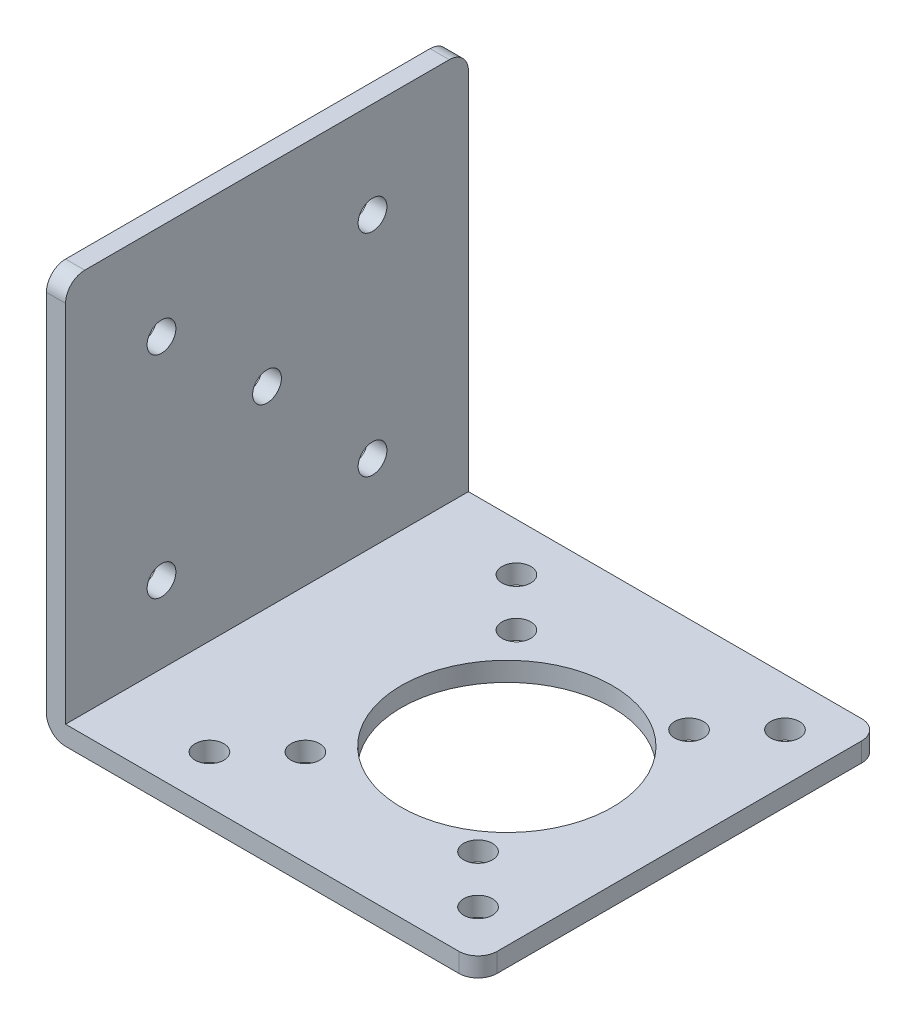
ISO-10303-21;
HEADER;
FILE_DESCRIPTION(('STEP AP214'),'2;1');
FILE_NAME('part.step','',(''),(''),'','','');
FILE_SCHEMA(('AUTOMOTIVE_DESIGN { 1 0 10303 214 1 1 1 1 }'));
ENDSEC;
DATA;
#1=APPLICATION_CONTEXT('core data for automotive mechanical design processes');
#2=APPLICATION_PROTOCOL_DEFINITION('international standard','automotive_design',2000,#1);
#3=PRODUCT_CONTEXT('',#1,'mechanical');
#4=PRODUCT('Part','Part','',(#3));
#5=PRODUCT_RELATED_PRODUCT_CATEGORY('part','',(#4));
#6=PRODUCT_DEFINITION_FORMATION('','',#4);
#7=PRODUCT_DEFINITION_CONTEXT('part definition',#1,'design');
#8=PRODUCT_DEFINITION('design','',#6,#7);
#9=PRODUCT_DEFINITION_SHAPE('','',#8);
#10=(LENGTH_UNIT() NAMED_UNIT(*) SI_UNIT(.MILLI.,.METRE.));
#11=(NAMED_UNIT(*) PLANE_ANGLE_UNIT() SI_UNIT($,.RADIAN.));
#12=(NAMED_UNIT(*) SI_UNIT($,.STERADIAN.) SOLID_ANGLE_UNIT());
#13=UNCERTAINTY_MEASURE_WITH_UNIT(LENGTH_MEASURE(1.E-05),#10,'distance_accuracy_value','');
#14=(GEOMETRIC_REPRESENTATION_CONTEXT(3) GLOBAL_UNCERTAINTY_ASSIGNED_CONTEXT((#13)) GLOBAL_UNIT_ASSIGNED_CONTEXT((#10,
#11,#12)) REPRESENTATION_CONTEXT('',''));
#15=CARTESIAN_POINT('',(0.,0.,0.));
#16=DIRECTION('',(0.,0.,1.));
#17=DIRECTION('',(1.,0.,0.));
#18=AXIS2_PLACEMENT_3D('',#15,#16,#17);
#19=CARTESIAN_POINT('',(0.,42.,-42.));
#20=DIRECTION('',(-1.,0.,0.));
#21=DIRECTION('',(0.,-1.,0.));
#22=AXIS2_PLACEMENT_3D('',#19,#20,#21);
#23=PLANE('',#22);
#24=CARTESIAN_POINT('',(0.,32.,-32.));
#25=DIRECTION('',(-1.,0.,0.));
#26=DIRECTION('',(0.,-1.,0.));
#27=AXIS2_PLACEMENT_3D('',#24,#25,#26);
#28=CIRCLE('',#27,1.5);
#29=CARTESIAN_POINT('',(0.,30.5,-32.));
#30=VERTEX_POINT('',#29);
#31=EDGE_CURVE('E326',#30,#30,#28,.F.);
#32=ORIENTED_EDGE('',*,*,#31,.T.);
#33=EDGE_LOOP('',(#32));
#34=FACE_BOUND('',#33,.T.);
#35=CARTESIAN_POINT('',(0.,32.,-10.));
#36=DIRECTION('',(-1.,0.,0.));
#37=DIRECTION('',(0.,-1.,0.));
#38=AXIS2_PLACEMENT_3D('',#35,#36,#37);
#39=CIRCLE('',#38,1.5);
#40=CARTESIAN_POINT('',(0.,30.5,-10.));
#41=VERTEX_POINT('',#40);
#42=EDGE_CURVE('E331',#41,#41,#39,.F.);
#43=ORIENTED_EDGE('',*,*,#42,.T.);
#44=EDGE_LOOP('',(#43));
#45=FACE_BOUND('',#44,.T.);
#46=CARTESIAN_POINT('',(0.,10.,-32.));
#47=DIRECTION('',(-1.,0.,0.));
#48=DIRECTION('',(0.,-1.,0.));
#49=AXIS2_PLACEMENT_3D('',#46,#47,#48);
#50=CIRCLE('',#49,1.5);
#51=CARTESIAN_POINT('',(0.,8.49999999999999,-32.));
#52=VERTEX_POINT('',#51);
#53=EDGE_CURVE('E337',#52,#52,#50,.F.);
#54=ORIENTED_EDGE('',*,*,#53,.T.);
#55=EDGE_LOOP('',(#54));
#56=FACE_BOUND('',#55,.T.);
#57=CARTESIAN_POINT('',(0.,22.,-21.));
#58=DIRECTION('',(-1.,0.,0.));
#59=DIRECTION('',(0.,-1.,0.));
#60=AXIS2_PLACEMENT_3D('',#57,#58,#59);
#61=CIRCLE('',#60,1.5);
#62=CARTESIAN_POINT('',(0.,20.5,-21.));
#63=VERTEX_POINT('',#62);
#64=EDGE_CURVE('E343',#63,#63,#61,.F.);
#65=ORIENTED_EDGE('',*,*,#64,.T.);
#66=EDGE_LOOP('',(#65));
#67=FACE_BOUND('',#66,.T.);
#68=CARTESIAN_POINT('',(0.,10.,-10.));
#69=DIRECTION('',(-1.,0.,0.));
#70=DIRECTION('',(0.,-1.,0.));
#71=AXIS2_PLACEMENT_3D('',#68,#69,#70);
#72=CIRCLE('',#71,1.5);
#73=CARTESIAN_POINT('',(0.,8.49999999999999,-10.));
#74=VERTEX_POINT('',#73);
#75=EDGE_CURVE('E320',#74,#74,#72,.F.);
#76=ORIENTED_EDGE('',*,*,#75,.T.);
#77=EDGE_LOOP('',(#76));
#78=FACE_BOUND('',#77,.T.);
#79=DIRECTION('',(0.,0.,1.));
#80=VECTOR('',#79,1.);
#81=CARTESIAN_POINT('',(0.,42.,-42.));
#82=LINE('',#81,#80);
#83=CARTESIAN_POINT('',(0.,42.,-40.));
#84=VERTEX_POINT('',#83);
#85=CARTESIAN_POINT('',(0.,42.,-2.00000000000002));
#86=VERTEX_POINT('',#85);
#87=EDGE_CURVE('E163',#84,#86,#82,.T.);
#88=ORIENTED_EDGE('',*,*,#87,.F.);
#89=CARTESIAN_POINT('',(0.,40.,-40.));
#90=DIRECTION('',(-1.,0.,0.));
#91=DIRECTION('',(0.,-1.,0.));
#92=AXIS2_PLACEMENT_3D('',#89,#90,#91);
#93=CIRCLE('',#92,2.);
#94=CARTESIAN_POINT('',(0.,40.,-42.));
#95=VERTEX_POINT('',#94);
#96=EDGE_CURVE('E60',#84,#95,#93,.T.);
#97=ORIENTED_EDGE('',*,*,#96,.T.);
#98=DIRECTION('',(0.,-1.,0.));
#99=VECTOR('',#98,1.);
#100=CARTESIAN_POINT('',(0.,42.,-42.));
#101=LINE('',#100,#99);
#102=CARTESIAN_POINT('',(0.,2.00000000000002,-42.));
#103=VERTEX_POINT('',#102);
#104=EDGE_CURVE('E162',#95,#103,#101,.T.);
#105=ORIENTED_EDGE('',*,*,#104,.T.);
#106=DIRECTION('',(0.,0.,1.));
#107=VECTOR('',#106,1.);
#108=CARTESIAN_POINT('',(0.,2.,-42.));
#109=LINE('',#108,#107);
#110=CARTESIAN_POINT('',(0.,2.00000000000002,0.));
#111=VERTEX_POINT('',#110);
#112=EDGE_CURVE('E165',#103,#111,#109,.T.);
#113=ORIENTED_EDGE('',*,*,#112,.T.);
#114=DIRECTION('',(0.,-1.,0.));
#115=VECTOR('',#114,1.);
#116=CARTESIAN_POINT('',(0.,42.,0.));
#117=LINE('',#116,#115);
#118=CARTESIAN_POINT('',(0.,40.,0.));
#119=VERTEX_POINT('',#118);
#120=EDGE_CURVE('E153',#119,#111,#117,.T.);
#121=ORIENTED_EDGE('',*,*,#120,.F.);
#122=CARTESIAN_POINT('',(0.,40.,-2.));
#123=DIRECTION('',(-1.,0.,0.));
#124=DIRECTION('',(0.,-1.,0.));
#125=AXIS2_PLACEMENT_3D('',#122,#123,#124);
#126=CIRCLE('',#125,2.);
#127=EDGE_CURVE('E52',#119,#86,#126,.T.);
#128=ORIENTED_EDGE('',*,*,#127,.T.);
#129=EDGE_LOOP('',(#88,#97,#105,#113,#121,#128));
#130=FACE_BOUND('',#129,.T.);
#131=ADVANCED_FACE('F37',(#34,#45,#56,#67,#78,#130),#23,.T.);
#132=CARTESIAN_POINT('',(2.,42.,-42.));
#133=DIRECTION('',(0.,1.,0.));
#134=DIRECTION('',(0.,0.,1.));
#135=AXIS2_PLACEMENT_3D('',#132,#133,#134);
#136=PLANE('',#135);
#137=DIRECTION('',(0.,0.,1.));
#138=VECTOR('',#137,1.);
#139=CARTESIAN_POINT('',(2.,42.,-42.));
#140=LINE('',#139,#138);
#141=CARTESIAN_POINT('',(2.,42.,-40.));
#142=VERTEX_POINT('',#141);
#143=CARTESIAN_POINT('',(2.,42.,-2.00000000000002));
#144=VERTEX_POINT('',#143);
#145=EDGE_CURVE('E141',#142,#144,#140,.T.);
#146=ORIENTED_EDGE('',*,*,#145,.F.);
#147=DIRECTION('',(-1.,0.,0.));
#148=VECTOR('',#147,1.);
#149=CARTESIAN_POINT('',(0.,42.,-40.));
#150=LINE('',#149,#148);
#151=EDGE_CURVE('E202',#142,#84,#150,.T.);
#152=ORIENTED_EDGE('',*,*,#151,.T.);
#153=ORIENTED_EDGE('',*,*,#87,.T.);
#154=DIRECTION('',(-1.,0.,0.));
#155=VECTOR('',#154,1.);
#156=CARTESIAN_POINT('',(2.,42.,-2.));
#157=LINE('',#156,#155);
#158=EDGE_CURVE('E200',#86,#144,#157,.F.);
#159=ORIENTED_EDGE('',*,*,#158,.T.);
#160=EDGE_LOOP('',(#146,#152,#153,#159));
#161=FACE_BOUND('',#160,.T.);
#162=ADVANCED_FACE('F213',(#161),#136,.T.);
#163=CARTESIAN_POINT('',(2.,2.,-42.));
#164=DIRECTION('',(1.,0.,0.));
#165=DIRECTION('',(0.,1.,0.));
#166=AXIS2_PLACEMENT_3D('',#163,#164,#165);
#167=PLANE('',#166);
#168=CARTESIAN_POINT('',(2.,32.,-32.));
#169=DIRECTION('',(1.,0.,0.));
#170=DIRECTION('',(0.,1.,0.));
#171=AXIS2_PLACEMENT_3D('',#168,#169,#170);
#172=CIRCLE('',#171,1.5);
#173=CARTESIAN_POINT('',(2.,33.5,-32.));
#174=VERTEX_POINT('',#173);
#175=EDGE_CURVE('E328',#174,#174,#172,.T.);
#176=ORIENTED_EDGE('',*,*,#175,.F.);
#177=EDGE_LOOP('',(#176));
#178=FACE_BOUND('',#177,.T.);
#179=CARTESIAN_POINT('',(2.,32.,-10.));
#180=DIRECTION('',(1.,0.,0.));
#181=DIRECTION('',(0.,1.,0.));
#182=AXIS2_PLACEMENT_3D('',#179,#180,#181);
#183=CIRCLE('',#182,1.5);
#184=CARTESIAN_POINT('',(2.,33.5,-10.));
#185=VERTEX_POINT('',#184);
#186=EDGE_CURVE('E334',#185,#185,#183,.T.);
#187=ORIENTED_EDGE('',*,*,#186,.F.);
#188=EDGE_LOOP('',(#187));
#189=FACE_BOUND('',#188,.T.);
#190=CARTESIAN_POINT('',(2.,10.,-32.));
#191=DIRECTION('',(1.,0.,0.));
#192=DIRECTION('',(0.,1.,0.));
#193=AXIS2_PLACEMENT_3D('',#190,#191,#192);
#194=CIRCLE('',#193,1.5);
#195=CARTESIAN_POINT('',(2.,11.5,-32.));
#196=VERTEX_POINT('',#195);
#197=EDGE_CURVE('E340',#196,#196,#194,.T.);
#198=ORIENTED_EDGE('',*,*,#197,.F.);
#199=EDGE_LOOP('',(#198));
#200=FACE_BOUND('',#199,.T.);
#201=CARTESIAN_POINT('',(2.,22.,-21.));
#202=DIRECTION('',(1.,0.,0.));
#203=DIRECTION('',(0.,1.,0.));
#204=AXIS2_PLACEMENT_3D('',#201,#202,#203);
#205=CIRCLE('',#204,1.5);
#206=CARTESIAN_POINT('',(2.,23.5,-21.));
#207=VERTEX_POINT('',#206);
#208=EDGE_CURVE('E323',#207,#207,#205,.T.);
#209=ORIENTED_EDGE('',*,*,#208,.F.);
#210=EDGE_LOOP('',(#209));
#211=FACE_BOUND('',#210,.T.);
#212=CARTESIAN_POINT('',(2.,10.,-10.));
#213=DIRECTION('',(1.,0.,0.));
#214=DIRECTION('',(0.,1.,0.));
#215=AXIS2_PLACEMENT_3D('',#212,#213,#214);
#216=CIRCLE('',#215,1.5);
#217=CARTESIAN_POINT('',(2.,11.5,-10.));
#218=VERTEX_POINT('',#217);
#219=EDGE_CURVE('E276',#218,#218,#216,.T.);
#220=ORIENTED_EDGE('',*,*,#219,.F.);
#221=EDGE_LOOP('',(#220));
#222=FACE_BOUND('',#221,.T.);
#223=DIRECTION('',(0.,1.,0.));
#224=VECTOR('',#223,1.);
#225=CARTESIAN_POINT('',(2.,2.,-42.));
#226=LINE('',#225,#224);
#227=CARTESIAN_POINT('',(2.,2.,-42.));
#228=VERTEX_POINT('',#227);
#229=CARTESIAN_POINT('',(2.,40.,-42.));
#230=VERTEX_POINT('',#229);
#231=EDGE_CURVE('E132',#228,#230,#226,.T.);
#232=ORIENTED_EDGE('',*,*,#231,.T.);
#233=CARTESIAN_POINT('',(2.,40.,-40.));
#234=DIRECTION('',(1.,0.,0.));
#235=DIRECTION('',(0.,1.,0.));
#236=AXIS2_PLACEMENT_3D('',#233,#234,#235);
#237=CIRCLE('',#236,2.);
#238=EDGE_CURVE('E11',#230,#142,#237,.T.);
#239=ORIENTED_EDGE('',*,*,#238,.T.);
#240=ORIENTED_EDGE('',*,*,#145,.T.);
#241=CARTESIAN_POINT('',(2.,40.,-2.));
#242=DIRECTION('',(1.,0.,0.));
#243=DIRECTION('',(0.,1.,0.));
#244=AXIS2_PLACEMENT_3D('',#241,#242,#243);
#245=CIRCLE('',#244,2.);
#246=CARTESIAN_POINT('',(2.,40.,0.));
#247=VERTEX_POINT('',#246);
#248=EDGE_CURVE('E45',#144,#247,#245,.T.);
#249=ORIENTED_EDGE('',*,*,#248,.T.);
#250=DIRECTION('',(0.,1.,0.));
#251=VECTOR('',#250,1.);
#252=CARTESIAN_POINT('',(2.,2.,0.));
#253=LINE('',#252,#251);
#254=CARTESIAN_POINT('',(2.,2.,0.));
#255=VERTEX_POINT('',#254);
#256=EDGE_CURVE('E140',#255,#247,#253,.T.);
#257=ORIENTED_EDGE('',*,*,#256,.F.);
#258=DIRECTION('',(0.,0.,1.));
#259=VECTOR('',#258,1.);
#260=CARTESIAN_POINT('',(2.,2.,-42.));
#261=LINE('',#260,#259);
#262=EDGE_CURVE('E126',#228,#255,#261,.T.);
#263=ORIENTED_EDGE('',*,*,#262,.F.);
#264=EDGE_LOOP('',(#232,#239,#240,#249,#257,#263));
#265=FACE_BOUND('',#264,.T.);
#266=ADVANCED_FACE('F137',(#178,#189,#200,#211,#222,#265),#167,.T.);
#267=CARTESIAN_POINT('',(45.,2.,-42.));
#268=DIRECTION('',(0.,1.,0.));
#269=DIRECTION('',(-1.,0.,0.));
#270=AXIS2_PLACEMENT_3D('',#267,#268,#269);
#271=PLANE('',#270);
#272=CARTESIAN_POINT('',(12.,2.,-5.));
#273=DIRECTION('',(0.,1.,0.));
#274=DIRECTION('',(-1.,0.,0.));
#275=AXIS2_PLACEMENT_3D('',#272,#273,#274);
#276=CIRCLE('',#275,1.5);
#277=CARTESIAN_POINT('',(10.5,2.,-5.));
#278=VERTEX_POINT('',#277);
#279=EDGE_CURVE('E275',#278,#278,#276,.T.);
#280=ORIENTED_EDGE('',*,*,#279,.F.);
#281=EDGE_LOOP('',(#280));
#282=FACE_BOUND('',#281,.T.);
#283=CARTESIAN_POINT('',(12.,2.,-37.));
#284=DIRECTION('',(0.,1.,0.));
#285=DIRECTION('',(-1.,0.,0.));
#286=AXIS2_PLACEMENT_3D('',#283,#284,#285);
#287=CIRCLE('',#286,1.5);
#288=CARTESIAN_POINT('',(10.5,2.,-37.));
#289=VERTEX_POINT('',#288);
#290=EDGE_CURVE('E282',#289,#289,#287,.T.);
#291=ORIENTED_EDGE('',*,*,#290,.F.);
#292=EDGE_LOOP('',(#291));
#293=FACE_BOUND('',#292,.T.);
#294=CARTESIAN_POINT('',(17.,2.,-32.));
#295=DIRECTION('',(0.,1.,0.));
#296=DIRECTION('',(-1.,0.,0.));
#297=AXIS2_PLACEMENT_3D('',#294,#295,#296);
#298=CIRCLE('',#297,1.5);
#299=CARTESIAN_POINT('',(15.5,2.,-32.));
#300=VERTEX_POINT('',#299);
#301=EDGE_CURVE('E288',#300,#300,#298,.T.);
#302=ORIENTED_EDGE('',*,*,#301,.F.);
#303=EDGE_LOOP('',(#302));
#304=FACE_BOUND('',#303,.T.);
#305=CARTESIAN_POINT('',(17.,2.,-10.));
#306=DIRECTION('',(0.,1.,0.));
#307=DIRECTION('',(-1.,0.,0.));
#308=AXIS2_PLACEMENT_3D('',#305,#306,#307);
#309=CIRCLE('',#308,1.5);
#310=CARTESIAN_POINT('',(15.5,2.,-10.));
#311=VERTEX_POINT('',#310);
#312=EDGE_CURVE('E294',#311,#311,#309,.T.);
#313=ORIENTED_EDGE('',*,*,#312,.F.);
#314=EDGE_LOOP('',(#313));
#315=FACE_BOUND('',#314,.T.);
#316=CARTESIAN_POINT('',(35.,2.,-10.));
#317=DIRECTION('',(0.,1.,0.));
#318=DIRECTION('',(-1.,0.,0.));
#319=AXIS2_PLACEMENT_3D('',#316,#317,#318);
#320=CIRCLE('',#319,1.5);
#321=CARTESIAN_POINT('',(33.5,2.,-10.));
#322=VERTEX_POINT('',#321);
#323=EDGE_CURVE('E300',#322,#322,#320,.T.);
#324=ORIENTED_EDGE('',*,*,#323,.F.);
#325=EDGE_LOOP('',(#324));
#326=FACE_BOUND('',#325,.T.);
#327=CARTESIAN_POINT('',(35.,2.,-32.));
#328=DIRECTION('',(0.,1.,0.));
#329=DIRECTION('',(-1.,0.,0.));
#330=AXIS2_PLACEMENT_3D('',#327,#328,#329);
#331=CIRCLE('',#330,1.5);
#332=CARTESIAN_POINT('',(33.5,2.,-32.));
#333=VERTEX_POINT('',#332);
#334=EDGE_CURVE('E306',#333,#333,#331,.T.);
#335=ORIENTED_EDGE('',*,*,#334,.F.);
#336=EDGE_LOOP('',(#335));
#337=FACE_BOUND('',#336,.T.);
#338=CARTESIAN_POINT('',(40.,2.,-5.));
#339=DIRECTION('',(0.,1.,0.));
#340=DIRECTION('',(-1.,0.,0.));
#341=AXIS2_PLACEMENT_3D('',#338,#339,#340);
#342=CIRCLE('',#341,1.5);
#343=CARTESIAN_POINT('',(38.5,2.,-5.));
#344=VERTEX_POINT('',#343);
#345=EDGE_CURVE('E312',#344,#344,#342,.T.);
#346=ORIENTED_EDGE('',*,*,#345,.F.);
#347=EDGE_LOOP('',(#346));
#348=FACE_BOUND('',#347,.T.);
#349=CARTESIAN_POINT('',(40.,2.,-37.));
#350=DIRECTION('',(0.,1.,0.));
#351=DIRECTION('',(-1.,0.,0.));
#352=AXIS2_PLACEMENT_3D('',#349,#350,#351);
#353=CIRCLE('',#352,1.5);
#354=CARTESIAN_POINT('',(38.5,2.,-37.));
#355=VERTEX_POINT('',#354);
#356=EDGE_CURVE('E269',#355,#355,#353,.T.);
#357=ORIENTED_EDGE('',*,*,#356,.F.);
#358=EDGE_LOOP('',(#357));
#359=FACE_BOUND('',#358,.T.);
#360=CARTESIAN_POINT('',(27.,2.,-21.));
#361=DIRECTION('',(0.,1.,0.));
#362=DIRECTION('',(-1.,0.,0.));
#363=AXIS2_PLACEMENT_3D('',#360,#361,#362);
#364=CIRCLE('',#363,11.);
#365=CARTESIAN_POINT('',(16.,2.,-21.));
#366=VERTEX_POINT('',#365);
#367=EDGE_CURVE('E156',#366,#366,#364,.T.);
#368=ORIENTED_EDGE('',*,*,#367,.F.);
#369=EDGE_LOOP('',(#368));
#370=FACE_BOUND('',#369,.T.);
#371=DIRECTION('',(0.,0.,1.));
#372=VECTOR('',#371,1.);
#373=CARTESIAN_POINT('',(45.,2.,-42.));
#374=LINE('',#373,#372);
#375=CARTESIAN_POINT('',(45.,2.,-40.));
#376=VERTEX_POINT('',#375);
#377=CARTESIAN_POINT('',(45.,2.,-2.00000000000002));
#378=VERTEX_POINT('',#377);
#379=EDGE_CURVE('E142',#376,#378,#374,.T.);
#380=ORIENTED_EDGE('',*,*,#379,.F.);
#381=CARTESIAN_POINT('',(43.,2.,-40.));
#382=DIRECTION('',(0.,1.,0.));
#383=DIRECTION('',(-1.,0.,0.));
#384=AXIS2_PLACEMENT_3D('',#381,#382,#383);
#385=CIRCLE('',#384,2.);
#386=CARTESIAN_POINT('',(43.,2.,-42.));
#387=VERTEX_POINT('',#386);
#388=EDGE_CURVE('E128',#376,#387,#385,.T.);
#389=ORIENTED_EDGE('',*,*,#388,.T.);
#390=DIRECTION('',(-1.,0.,0.));
#391=VECTOR('',#390,1.);
#392=CARTESIAN_POINT('',(45.,2.,-42.));
#393=LINE('',#392,#391);
#394=EDGE_CURVE('E121',#387,#228,#393,.T.);
#395=ORIENTED_EDGE('',*,*,#394,.T.);
#396=ORIENTED_EDGE('',*,*,#262,.T.);
#397=DIRECTION('',(-1.,0.,0.));
#398=VECTOR('',#397,1.);
#399=CARTESIAN_POINT('',(45.,2.,0.));
#400=LINE('',#399,#398);
#401=CARTESIAN_POINT('',(43.,2.,0.));
#402=VERTEX_POINT('',#401);
#403=EDGE_CURVE('E159',#402,#255,#400,.T.);
#404=ORIENTED_EDGE('',*,*,#403,.F.);
#405=CARTESIAN_POINT('',(43.,2.,-2.));
#406=DIRECTION('',(0.,1.,0.));
#407=DIRECTION('',(-1.,0.,0.));
#408=AXIS2_PLACEMENT_3D('',#405,#406,#407);
#409=CIRCLE('',#408,2.);
#410=EDGE_CURVE('E184',#402,#378,#409,.T.);
#411=ORIENTED_EDGE('',*,*,#410,.T.);
#412=EDGE_LOOP('',(#380,#389,#395,#396,#404,#411));
#413=FACE_BOUND('',#412,.T.);
#414=ADVANCED_FACE('F124',(#282,#293,#304,#315,#326,#337,#348,#359,#370,#413),#271,.T.);
#415=CARTESIAN_POINT('',(45.,0.,-42.));
#416=DIRECTION('',(1.,0.,0.));
#417=DIRECTION('',(0.,0.,-1.));
#418=AXIS2_PLACEMENT_3D('',#415,#416,#417);
#419=PLANE('',#418);
#420=DIRECTION('',(0.,0.,1.));
#421=VECTOR('',#420,1.);
#422=CARTESIAN_POINT('',(45.,0.,-42.));
#423=LINE('',#422,#421);
#424=CARTESIAN_POINT('',(45.,0.,-40.));
#425=VERTEX_POINT('',#424);
#426=CARTESIAN_POINT('',(45.,0.,-2.00000000000002));
#427=VERTEX_POINT('',#426);
#428=EDGE_CURVE('E147',#425,#427,#423,.T.);
#429=ORIENTED_EDGE('',*,*,#428,.F.);
#430=DIRECTION('',(0.,1.,0.));
#431=VECTOR('',#430,1.);
#432=CARTESIAN_POINT('',(45.,2.,-40.));
#433=LINE('',#432,#431);
#434=EDGE_CURVE('E181',#425,#376,#433,.T.);
#435=ORIENTED_EDGE('',*,*,#434,.T.);
#436=ORIENTED_EDGE('',*,*,#379,.T.);
#437=DIRECTION('',(0.,1.,0.));
#438=VECTOR('',#437,1.);
#439=CARTESIAN_POINT('',(45.,0.,-2.));
#440=LINE('',#439,#438);
#441=EDGE_CURVE('E179',#378,#427,#440,.F.);
#442=ORIENTED_EDGE('',*,*,#441,.T.);
#443=EDGE_LOOP('',(#429,#435,#436,#442));
#444=FACE_BOUND('',#443,.T.);
#445=ADVANCED_FACE('F259',(#444),#419,.T.);
#446=CARTESIAN_POINT('',(0.,0.,-42.));
#447=DIRECTION('',(0.,-1.,0.));
#448=DIRECTION('',(0.,0.,-1.));
#449=AXIS2_PLACEMENT_3D('',#446,#447,#448);
#450=PLANE('',#449);
#451=CARTESIAN_POINT('',(12.,0.,-5.));
#452=DIRECTION('',(0.,-1.,0.));
#453=DIRECTION('',(0.,0.,-1.));
#454=AXIS2_PLACEMENT_3D('',#451,#452,#453);
#455=CIRCLE('',#454,1.5);
#456=CARTESIAN_POINT('',(12.,0.,-6.5));
#457=VERTEX_POINT('',#456);
#458=EDGE_CURVE('E272',#457,#457,#455,.F.);
#459=ORIENTED_EDGE('',*,*,#458,.T.);
#460=EDGE_LOOP('',(#459));
#461=FACE_BOUND('',#460,.T.);
#462=CARTESIAN_POINT('',(12.,0.,-37.));
#463=DIRECTION('',(0.,-1.,0.));
#464=DIRECTION('',(0.,0.,-1.));
#465=AXIS2_PLACEMENT_3D('',#462,#463,#464);
#466=CIRCLE('',#465,1.5);
#467=CARTESIAN_POINT('',(12.,0.,-38.5));
#468=VERTEX_POINT('',#467);
#469=EDGE_CURVE('E279',#468,#468,#466,.F.);
#470=ORIENTED_EDGE('',*,*,#469,.T.);
#471=EDGE_LOOP('',(#470));
#472=FACE_BOUND('',#471,.T.);
#473=CARTESIAN_POINT('',(17.,0.,-32.));
#474=DIRECTION('',(0.,-1.,0.));
#475=DIRECTION('',(0.,0.,-1.));
#476=AXIS2_PLACEMENT_3D('',#473,#474,#475);
#477=CIRCLE('',#476,1.5);
#478=CARTESIAN_POINT('',(17.,0.,-33.5));
#479=VERTEX_POINT('',#478);
#480=EDGE_CURVE('E285',#479,#479,#477,.F.);
#481=ORIENTED_EDGE('',*,*,#480,.T.);
#482=EDGE_LOOP('',(#481));
#483=FACE_BOUND('',#482,.T.);
#484=CARTESIAN_POINT('',(17.,0.,-10.));
#485=DIRECTION('',(0.,-1.,0.));
#486=DIRECTION('',(0.,0.,-1.));
#487=AXIS2_PLACEMENT_3D('',#484,#485,#486);
#488=CIRCLE('',#487,1.5);
#489=CARTESIAN_POINT('',(17.,0.,-11.5));
#490=VERTEX_POINT('',#489);
#491=EDGE_CURVE('E291',#490,#490,#488,.F.);
#492=ORIENTED_EDGE('',*,*,#491,.T.);
#493=EDGE_LOOP('',(#492));
#494=FACE_BOUND('',#493,.T.);
#495=CARTESIAN_POINT('',(35.,0.,-10.));
#496=DIRECTION('',(0.,-1.,0.));
#497=DIRECTION('',(0.,0.,-1.));
#498=AXIS2_PLACEMENT_3D('',#495,#496,#497);
#499=CIRCLE('',#498,1.5);
#500=CARTESIAN_POINT('',(35.,0.,-11.5));
#501=VERTEX_POINT('',#500);
#502=EDGE_CURVE('E297',#501,#501,#499,.F.);
#503=ORIENTED_EDGE('',*,*,#502,.T.);
#504=EDGE_LOOP('',(#503));
#505=FACE_BOUND('',#504,.T.);
#506=CARTESIAN_POINT('',(35.,0.,-32.));
#507=DIRECTION('',(0.,-1.,0.));
#508=DIRECTION('',(0.,0.,-1.));
#509=AXIS2_PLACEMENT_3D('',#506,#507,#508);
#510=CIRCLE('',#509,1.5);
#511=CARTESIAN_POINT('',(35.,0.,-33.5));
#512=VERTEX_POINT('',#511);
#513=EDGE_CURVE('E303',#512,#512,#510,.F.);
#514=ORIENTED_EDGE('',*,*,#513,.T.);
#515=EDGE_LOOP('',(#514));
#516=FACE_BOUND('',#515,.T.);
#517=CARTESIAN_POINT('',(40.,0.,-5.));
#518=DIRECTION('',(0.,-1.,0.));
#519=DIRECTION('',(0.,0.,-1.));
#520=AXIS2_PLACEMENT_3D('',#517,#518,#519);
#521=CIRCLE('',#520,1.5);
#522=CARTESIAN_POINT('',(40.,0.,-6.5));
#523=VERTEX_POINT('',#522);
#524=EDGE_CURVE('E309',#523,#523,#521,.F.);
#525=ORIENTED_EDGE('',*,*,#524,.T.);
#526=EDGE_LOOP('',(#525));
#527=FACE_BOUND('',#526,.T.);
#528=CARTESIAN_POINT('',(40.,0.,-37.));
#529=DIRECTION('',(0.,-1.,0.));
#530=DIRECTION('',(0.,0.,-1.));
#531=AXIS2_PLACEMENT_3D('',#528,#529,#530);
#532=CIRCLE('',#531,1.5);
#533=CARTESIAN_POINT('',(40.,0.,-38.5));
#534=VERTEX_POINT('',#533);
#535=EDGE_CURVE('E315',#534,#534,#532,.F.);
#536=ORIENTED_EDGE('',*,*,#535,.T.);
#537=EDGE_LOOP('',(#536));
#538=FACE_BOUND('',#537,.T.);
#539=CARTESIAN_POINT('',(27.,0.,-21.));
#540=DIRECTION('',(0.,-1.,0.));
#541=DIRECTION('',(0.,0.,-1.));
#542=AXIS2_PLACEMENT_3D('',#539,#540,#541);
#543=CIRCLE('',#542,11.);
#544=CARTESIAN_POINT('',(27.,0.,-32.));
#545=VERTEX_POINT('',#544);
#546=EDGE_CURVE('E266',#545,#545,#543,.F.);
#547=ORIENTED_EDGE('',*,*,#546,.T.);
#548=EDGE_LOOP('',(#547));
#549=FACE_BOUND('',#548,.T.);
#550=DIRECTION('',(1.,0.,0.));
#551=VECTOR('',#550,1.);
#552=CARTESIAN_POINT('',(0.,0.,-42.));
#553=LINE('',#552,#551);
#554=CARTESIAN_POINT('',(2.,0.,-42.));
#555=VERTEX_POINT('',#554);
#556=CARTESIAN_POINT('',(43.,0.,-42.));
#557=VERTEX_POINT('',#556);
#558=EDGE_CURVE('E133',#555,#557,#553,.T.);
#559=ORIENTED_EDGE('',*,*,#558,.T.);
#560=CARTESIAN_POINT('',(43.,0.,-40.));
#561=DIRECTION('',(0.,-1.,0.));
#562=DIRECTION('',(0.,0.,-1.));
#563=AXIS2_PLACEMENT_3D('',#560,#561,#562);
#564=CIRCLE('',#563,2.);
#565=EDGE_CURVE('E192',#557,#425,#564,.T.);
#566=ORIENTED_EDGE('',*,*,#565,.T.);
#567=ORIENTED_EDGE('',*,*,#428,.T.);
#568=CARTESIAN_POINT('',(43.,0.,-2.));
#569=DIRECTION('',(0.,-1.,0.));
#570=DIRECTION('',(0.,0.,-1.));
#571=AXIS2_PLACEMENT_3D('',#568,#569,#570);
#572=CIRCLE('',#571,2.);
#573=CARTESIAN_POINT('',(43.,0.,0.));
#574=VERTEX_POINT('',#573);
#575=EDGE_CURVE('E190',#427,#574,#572,.T.);
#576=ORIENTED_EDGE('',*,*,#575,.T.);
#577=DIRECTION('',(1.,0.,0.));
#578=VECTOR('',#577,1.);
#579=CARTESIAN_POINT('',(0.,0.,0.));
#580=LINE('',#579,#578);
#581=CARTESIAN_POINT('',(2.,0.,0.));
#582=VERTEX_POINT('',#581);
#583=EDGE_CURVE('E155',#582,#574,#580,.T.);
#584=ORIENTED_EDGE('',*,*,#583,.F.);
#585=DIRECTION('',(0.,0.,1.));
#586=VECTOR('',#585,1.);
#587=CARTESIAN_POINT('',(2.,0.,-42.));
#588=LINE('',#587,#586);
#589=EDGE_CURVE('E174',#582,#555,#588,.F.);
#590=ORIENTED_EDGE('',*,*,#589,.T.);
#591=EDGE_LOOP('',(#559,#566,#567,#576,#584,#590));
#592=FACE_BOUND('',#591,.T.);
#593=ADVANCED_FACE('F242',(#461,#472,#483,#494,#505,#516,#527,#538,#549,#592),#450,.T.);
#594=CARTESIAN_POINT('',(0.,0.,-42.));
#595=DIRECTION('',(0.,0.,1.));
#596=DIRECTION('',(1.,0.,0.));
#597=AXIS2_PLACEMENT_3D('',#594,#595,#596);
#598=PLANE('',#597);
#599=ORIENTED_EDGE('',*,*,#394,.F.);
#600=DIRECTION('',(0.,1.,0.));
#601=VECTOR('',#600,1.);
#602=CARTESIAN_POINT('',(43.,0.,-42.));
#603=LINE('',#602,#601);
#604=EDGE_CURVE('E188',#387,#557,#603,.F.);
#605=ORIENTED_EDGE('',*,*,#604,.T.);
#606=ORIENTED_EDGE('',*,*,#558,.F.);
#607=CARTESIAN_POINT('',(2.,2.,-42.));
#608=DIRECTION('',(0.,0.,1.));
#609=DIRECTION('',(1.,0.,0.));
#610=AXIS2_PLACEMENT_3D('',#607,#608,#609);
#611=CIRCLE('',#610,2.);
#612=EDGE_CURVE('E176',#555,#103,#611,.F.);
#613=ORIENTED_EDGE('',*,*,#612,.T.);
#614=ORIENTED_EDGE('',*,*,#104,.F.);
#615=DIRECTION('',(-1.,0.,0.));
#616=VECTOR('',#615,1.);
#617=CARTESIAN_POINT('',(2.,40.,-42.));
#618=LINE('',#617,#616);
#619=EDGE_CURVE('E146',#95,#230,#618,.F.);
#620=ORIENTED_EDGE('',*,*,#619,.T.);
#621=ORIENTED_EDGE('',*,*,#231,.F.);
#622=EDGE_LOOP('',(#599,#605,#606,#613,#614,#620,#621));
#623=FACE_BOUND('',#622,.T.);
#624=ADVANCED_FACE('F144',(#623),#598,.F.);
#625=CARTESIAN_POINT('',(0.,0.,0.));
#626=DIRECTION('',(0.,0.,1.));
#627=DIRECTION('',(1.,0.,0.));
#628=AXIS2_PLACEMENT_3D('',#625,#626,#627);
#629=PLANE('',#628);
#630=ORIENTED_EDGE('',*,*,#583,.T.);
#631=DIRECTION('',(0.,1.,0.));
#632=VECTOR('',#631,1.);
#633=CARTESIAN_POINT('',(43.,0.,0.));
#634=LINE('',#633,#632);
#635=EDGE_CURVE('E197',#574,#402,#634,.T.);
#636=ORIENTED_EDGE('',*,*,#635,.T.);
#637=ORIENTED_EDGE('',*,*,#403,.T.);
#638=ORIENTED_EDGE('',*,*,#256,.T.);
#639=DIRECTION('',(-1.,0.,0.));
#640=VECTOR('',#639,1.);
#641=CARTESIAN_POINT('',(0.,40.,0.));
#642=LINE('',#641,#640);
#643=EDGE_CURVE('E194',#247,#119,#642,.T.);
#644=ORIENTED_EDGE('',*,*,#643,.T.);
#645=ORIENTED_EDGE('',*,*,#120,.T.);
#646=CARTESIAN_POINT('',(2.,2.,0.));
#647=DIRECTION('',(0.,0.,1.));
#648=DIRECTION('',(1.,0.,0.));
#649=AXIS2_PLACEMENT_3D('',#646,#647,#648);
#650=CIRCLE('',#649,2.);
#651=EDGE_CURVE('E172',#111,#582,#650,.T.);
#652=ORIENTED_EDGE('',*,*,#651,.T.);
#653=EDGE_LOOP('',(#630,#636,#637,#638,#644,#645,#652));
#654=FACE_BOUND('',#653,.T.);
#655=ADVANCED_FACE('F211',(#654),#629,.T.);
#656=CARTESIAN_POINT('',(2.,2.,-42.));
#657=DIRECTION('',(0.,0.,1.));
#658=DIRECTION('',(1.,0.,0.));
#659=AXIS2_PLACEMENT_3D('',#656,#657,#658);
#660=CYLINDRICAL_SURFACE('',#659,2.);
#661=ORIENTED_EDGE('',*,*,#612,.F.);
#662=ORIENTED_EDGE('',*,*,#589,.F.);
#663=ORIENTED_EDGE('',*,*,#651,.F.);
#664=ORIENTED_EDGE('',*,*,#112,.F.);
#665=EDGE_LOOP('',(#661,#662,#663,#664));
#666=FACE_BOUND('',#665,.T.);
#667=ADVANCED_FACE('F244',(#666),#660,.T.);
#668=CARTESIAN_POINT('',(43.,0.,-40.));
#669=DIRECTION('',(0.,-1.,0.));
#670=DIRECTION('',(0.,0.,-1.));
#671=AXIS2_PLACEMENT_3D('',#668,#669,#670);
#672=CYLINDRICAL_SURFACE('',#671,2.);
#673=ORIENTED_EDGE('',*,*,#565,.F.);
#674=ORIENTED_EDGE('',*,*,#604,.F.);
#675=ORIENTED_EDGE('',*,*,#388,.F.);
#676=ORIENTED_EDGE('',*,*,#434,.F.);
#677=EDGE_LOOP('',(#673,#674,#675,#676));
#678=FACE_BOUND('',#677,.T.);
#679=ADVANCED_FACE('F226',(#678),#672,.T.);
#680=CARTESIAN_POINT('',(43.,0.,-2.));
#681=DIRECTION('',(0.,1.,0.));
#682=DIRECTION('',(0.,0.,1.));
#683=AXIS2_PLACEMENT_3D('',#680,#681,#682);
#684=CYLINDRICAL_SURFACE('',#683,2.);
#685=ORIENTED_EDGE('',*,*,#575,.F.);
#686=ORIENTED_EDGE('',*,*,#441,.F.);
#687=ORIENTED_EDGE('',*,*,#410,.F.);
#688=ORIENTED_EDGE('',*,*,#635,.F.);
#689=EDGE_LOOP('',(#685,#686,#687,#688));
#690=FACE_BOUND('',#689,.T.);
#691=ADVANCED_FACE('F220',(#690),#684,.T.);
#692=CARTESIAN_POINT('',(2.,40.,-40.));
#693=DIRECTION('',(1.,0.,0.));
#694=DIRECTION('',(0.,0.,-1.));
#695=AXIS2_PLACEMENT_3D('',#692,#693,#694);
#696=CYLINDRICAL_SURFACE('',#695,2.);
#697=ORIENTED_EDGE('',*,*,#238,.F.);
#698=ORIENTED_EDGE('',*,*,#619,.F.);
#699=ORIENTED_EDGE('',*,*,#96,.F.);
#700=ORIENTED_EDGE('',*,*,#151,.F.);
#701=EDGE_LOOP('',(#697,#698,#699,#700));
#702=FACE_BOUND('',#701,.T.);
#703=ADVANCED_FACE('F218',(#702),#696,.T.);
#704=CARTESIAN_POINT('',(0.,40.,-2.));
#705=DIRECTION('',(-1.,0.,0.));
#706=DIRECTION('',(0.,0.,1.));
#707=AXIS2_PLACEMENT_3D('',#704,#705,#706);
#708=CYLINDRICAL_SURFACE('',#707,2.);
#709=ORIENTED_EDGE('',*,*,#248,.F.);
#710=ORIENTED_EDGE('',*,*,#158,.F.);
#711=ORIENTED_EDGE('',*,*,#127,.F.);
#712=ORIENTED_EDGE('',*,*,#643,.F.);
#713=EDGE_LOOP('',(#709,#710,#711,#712));
#714=FACE_BOUND('',#713,.T.);
#715=ADVANCED_FACE('F39',(#714),#708,.T.);
#716=CARTESIAN_POINT('',(27.,-0.0010000000000023,-21.));
#717=DIRECTION('',(0.,1.,0.));
#718=DIRECTION('',(-1.,0.,0.));
#719=AXIS2_PLACEMENT_3D('',#716,#717,#718);
#720=CYLINDRICAL_SURFACE('',#719,11.);
#721=ORIENTED_EDGE('',*,*,#546,.F.);
#722=EDGE_LOOP('',(#721));
#723=FACE_BOUND('',#722,.T.);
#724=ORIENTED_EDGE('',*,*,#367,.T.);
#725=EDGE_LOOP('',(#724));
#726=FACE_BOUND('',#725,.T.);
#727=ADVANCED_FACE('F225',(#723,#726),#720,.F.);
#728=CARTESIAN_POINT('',(40.,-0.00100000000000057,-37.));
#729=DIRECTION('',(0.,1.,0.));
#730=DIRECTION('',(-1.,0.,0.));
#731=AXIS2_PLACEMENT_3D('',#728,#729,#730);
#732=CYLINDRICAL_SURFACE('',#731,1.5);
#733=ORIENTED_EDGE('',*,*,#535,.F.);
#734=EDGE_LOOP('',(#733));
#735=FACE_BOUND('',#734,.T.);
#736=ORIENTED_EDGE('',*,*,#356,.T.);
#737=EDGE_LOOP('',(#736));
#738=FACE_BOUND('',#737,.T.);
#739=ADVANCED_FACE('F376',(#735,#738),#732,.F.);
#740=CARTESIAN_POINT('',(40.,-0.00100000000000057,-5.));
#741=DIRECTION('',(0.,1.,0.));
#742=DIRECTION('',(-1.,0.,0.));
#743=AXIS2_PLACEMENT_3D('',#740,#741,#742);
#744=CYLINDRICAL_SURFACE('',#743,1.5);
#745=ORIENTED_EDGE('',*,*,#524,.F.);
#746=EDGE_LOOP('',(#745));
#747=FACE_BOUND('',#746,.T.);
#748=ORIENTED_EDGE('',*,*,#345,.T.);
#749=EDGE_LOOP('',(#748));
#750=FACE_BOUND('',#749,.T.);
#751=ADVANCED_FACE('F379',(#747,#750),#744,.F.);
#752=CARTESIAN_POINT('',(35.,-0.001000000000001,-32.));
#753=DIRECTION('',(0.,1.,0.));
#754=DIRECTION('',(-1.,0.,0.));
#755=AXIS2_PLACEMENT_3D('',#752,#753,#754);
#756=CYLINDRICAL_SURFACE('',#755,1.5);
#757=ORIENTED_EDGE('',*,*,#513,.F.);
#758=EDGE_LOOP('',(#757));
#759=FACE_BOUND('',#758,.T.);
#760=ORIENTED_EDGE('',*,*,#334,.T.);
#761=EDGE_LOOP('',(#760));
#762=FACE_BOUND('',#761,.T.);
#763=ADVANCED_FACE('F383',(#759,#762),#756,.F.);
#764=CARTESIAN_POINT('',(35.,-0.001000000000001,-10.));
#765=DIRECTION('',(0.,1.,0.));
#766=DIRECTION('',(-1.,0.,0.));
#767=AXIS2_PLACEMENT_3D('',#764,#765,#766);
#768=CYLINDRICAL_SURFACE('',#767,1.5);
#769=ORIENTED_EDGE('',*,*,#502,.F.);
#770=EDGE_LOOP('',(#769));
#771=FACE_BOUND('',#770,.T.);
#772=ORIENTED_EDGE('',*,*,#323,.T.);
#773=EDGE_LOOP('',(#772));
#774=FACE_BOUND('',#773,.T.);
#775=ADVANCED_FACE('F387',(#771,#774),#768,.F.);
#776=CARTESIAN_POINT('',(17.,-0.00100000000000317,-10.));
#777=DIRECTION('',(0.,1.,0.));
#778=DIRECTION('',(-1.,0.,0.));
#779=AXIS2_PLACEMENT_3D('',#776,#777,#778);
#780=CYLINDRICAL_SURFACE('',#779,1.5);
#781=ORIENTED_EDGE('',*,*,#491,.F.);
#782=EDGE_LOOP('',(#781));
#783=FACE_BOUND('',#782,.T.);
#784=ORIENTED_EDGE('',*,*,#312,.T.);
#785=EDGE_LOOP('',(#784));
#786=FACE_BOUND('',#785,.T.);
#787=ADVANCED_FACE('F391',(#783,#786),#780,.F.);
#788=CARTESIAN_POINT('',(17.,-0.00100000000000317,-32.));
#789=DIRECTION('',(0.,1.,0.));
#790=DIRECTION('',(-1.,0.,0.));
#791=AXIS2_PLACEMENT_3D('',#788,#789,#790);
#792=CYLINDRICAL_SURFACE('',#791,1.5);
#793=ORIENTED_EDGE('',*,*,#480,.F.);
#794=EDGE_LOOP('',(#793));
#795=FACE_BOUND('',#794,.T.);
#796=ORIENTED_EDGE('',*,*,#301,.T.);
#797=EDGE_LOOP('',(#796));
#798=FACE_BOUND('',#797,.T.);
#799=ADVANCED_FACE('F395',(#795,#798),#792,.F.);
#800=CARTESIAN_POINT('',(12.,-0.00100000000000404,-37.));
#801=DIRECTION('',(0.,1.,0.));
#802=DIRECTION('',(-1.,0.,0.));
#803=AXIS2_PLACEMENT_3D('',#800,#801,#802);
#804=CYLINDRICAL_SURFACE('',#803,1.5);
#805=ORIENTED_EDGE('',*,*,#469,.F.);
#806=EDGE_LOOP('',(#805));
#807=FACE_BOUND('',#806,.T.);
#808=ORIENTED_EDGE('',*,*,#290,.T.);
#809=EDGE_LOOP('',(#808));
#810=FACE_BOUND('',#809,.T.);
#811=ADVANCED_FACE('F368',(#807,#810),#804,.F.);
#812=CARTESIAN_POINT('',(12.,-0.00100000000000404,-5.));
#813=DIRECTION('',(0.,1.,0.));
#814=DIRECTION('',(-1.,0.,0.));
#815=AXIS2_PLACEMENT_3D('',#812,#813,#814);
#816=CYLINDRICAL_SURFACE('',#815,1.5);
#817=ORIENTED_EDGE('',*,*,#458,.F.);
#818=EDGE_LOOP('',(#817));
#819=FACE_BOUND('',#818,.T.);
#820=ORIENTED_EDGE('',*,*,#279,.T.);
#821=EDGE_LOOP('',(#820));
#822=FACE_BOUND('',#821,.T.);
#823=ADVANCED_FACE('F358',(#819,#822),#816,.F.);
#824=CARTESIAN_POINT('',(-0.0010000000000023,10.,-10.));
#825=DIRECTION('',(1.,0.,0.));
#826=DIRECTION('',(0.,1.,0.));
#827=AXIS2_PLACEMENT_3D('',#824,#825,#826);
#828=CYLINDRICAL_SURFACE('',#827,1.5);
#829=ORIENTED_EDGE('',*,*,#75,.F.);
#830=EDGE_LOOP('',(#829));
#831=FACE_BOUND('',#830,.T.);
#832=ORIENTED_EDGE('',*,*,#219,.T.);
#833=EDGE_LOOP('',(#832));
#834=FACE_BOUND('',#833,.T.);
#835=ADVANCED_FACE('F356',(#831,#834),#828,.F.);
#836=CARTESIAN_POINT('',(-0.00100000000000317,22.,-21.));
#837=DIRECTION('',(1.,0.,0.));
#838=DIRECTION('',(0.,1.,0.));
#839=AXIS2_PLACEMENT_3D('',#836,#837,#838);
#840=CYLINDRICAL_SURFACE('',#839,1.5);
#841=ORIENTED_EDGE('',*,*,#64,.F.);
#842=EDGE_LOOP('',(#841));
#843=FACE_BOUND('',#842,.T.);
#844=ORIENTED_EDGE('',*,*,#208,.T.);
#845=EDGE_LOOP('',(#844));
#846=FACE_BOUND('',#845,.T.);
#847=ADVANCED_FACE('F349',(#843,#846),#840,.F.);
#848=CARTESIAN_POINT('',(-0.0010000000000023,10.,-32.));
#849=DIRECTION('',(1.,0.,0.));
#850=DIRECTION('',(0.,1.,0.));
#851=AXIS2_PLACEMENT_3D('',#848,#849,#850);
#852=CYLINDRICAL_SURFACE('',#851,1.5);
#853=ORIENTED_EDGE('',*,*,#53,.F.);
#854=EDGE_LOOP('',(#853));
#855=FACE_BOUND('',#854,.T.);
#856=ORIENTED_EDGE('',*,*,#197,.T.);
#857=EDGE_LOOP('',(#856));
#858=FACE_BOUND('',#857,.T.);
#859=ADVANCED_FACE('F365',(#855,#858),#852,.F.);
#860=CARTESIAN_POINT('',(-0.00100000000000404,32.,-10.));
#861=DIRECTION('',(1.,0.,0.));
#862=DIRECTION('',(0.,1.,0.));
#863=AXIS2_PLACEMENT_3D('',#860,#861,#862);
#864=CYLINDRICAL_SURFACE('',#863,1.5);
#865=ORIENTED_EDGE('',*,*,#42,.F.);
#866=EDGE_LOOP('',(#865));
#867=FACE_BOUND('',#866,.T.);
#868=ORIENTED_EDGE('',*,*,#186,.T.);
#869=EDGE_LOOP('',(#868));
#870=FACE_BOUND('',#869,.T.);
#871=ADVANCED_FACE('F536',(#867,#870),#864,.F.);
#872=CARTESIAN_POINT('',(-0.00100000000000404,32.,-32.));
#873=DIRECTION('',(1.,0.,0.));
#874=DIRECTION('',(0.,1.,0.));
#875=AXIS2_PLACEMENT_3D('',#872,#873,#874);
#876=CYLINDRICAL_SURFACE('',#875,1.5);
#877=ORIENTED_EDGE('',*,*,#31,.F.);
#878=EDGE_LOOP('',(#877));
#879=FACE_BOUND('',#878,.T.);
#880=ORIENTED_EDGE('',*,*,#175,.T.);
#881=EDGE_LOOP('',(#880));
#882=FACE_BOUND('',#881,.T.);
#883=ADVANCED_FACE('F374',(#879,#882),#876,.F.);
#884=CLOSED_SHELL('',(#131,#162,#266,#414,#445,#593,#624,#655,#667,#679,#691,#703,#715,#727,
#739,#751,#763,#775,#787,#799,#811,#823,#835,#847,#859,#871,#883));
#885=MANIFOLD_SOLID_BREP('B2',#884);
#886=ADVANCED_BREP_SHAPE_REPRESENTATION('',(#18,#885),#14);
#887=SHAPE_DEFINITION_REPRESENTATION(#9,#886);
ENDSEC;
END-ISO-10303-21;
